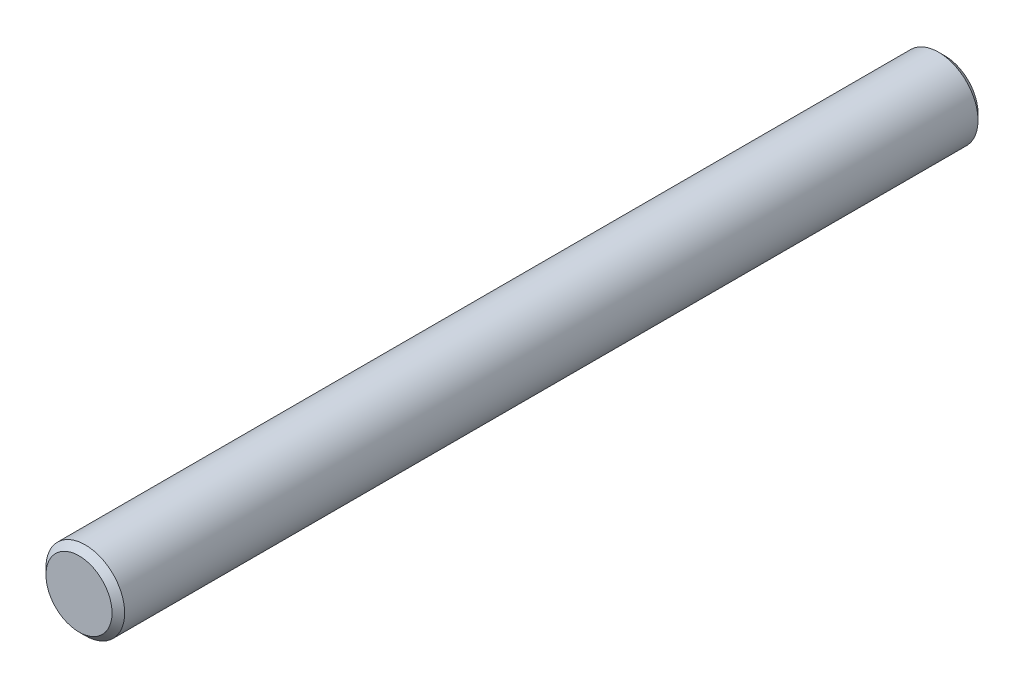
ISO-10303-21;
HEADER;
FILE_DESCRIPTION(('STEP AP214'),'2;1');
FILE_NAME('part.step','',(''),(''),'','','');
FILE_SCHEMA(('AUTOMOTIVE_DESIGN { 1 0 10303 214 1 1 1 1 }'));
ENDSEC;
DATA;
#1=APPLICATION_CONTEXT('core data for automotive mechanical design processes');
#2=APPLICATION_PROTOCOL_DEFINITION('international standard','automotive_design',2000,#1);
#3=PRODUCT_CONTEXT('',#1,'mechanical');
#4=PRODUCT('Part','Part','',(#3));
#5=PRODUCT_RELATED_PRODUCT_CATEGORY('part','',(#4));
#6=PRODUCT_DEFINITION_FORMATION('','',#4);
#7=PRODUCT_DEFINITION_CONTEXT('part definition',#1,'design');
#8=PRODUCT_DEFINITION('design','',#6,#7);
#9=PRODUCT_DEFINITION_SHAPE('','',#8);
#10=(LENGTH_UNIT() NAMED_UNIT(*) SI_UNIT(.MILLI.,.METRE.));
#11=(NAMED_UNIT(*) PLANE_ANGLE_UNIT() SI_UNIT($,.RADIAN.));
#12=(NAMED_UNIT(*) SI_UNIT($,.STERADIAN.) SOLID_ANGLE_UNIT());
#13=UNCERTAINTY_MEASURE_WITH_UNIT(LENGTH_MEASURE(1.E-05),#10,'distance_accuracy_value','');
#14=(GEOMETRIC_REPRESENTATION_CONTEXT(3) GLOBAL_UNCERTAINTY_ASSIGNED_CONTEXT((#13)) GLOBAL_UNIT_ASSIGNED_CONTEXT((#10,
#11,#12)) REPRESENTATION_CONTEXT('',''));
#15=CARTESIAN_POINT('',(0.,0.,0.));
#16=DIRECTION('',(0.,0.,1.));
#17=DIRECTION('',(1.,0.,0.));
#18=AXIS2_PLACEMENT_3D('',#15,#16,#17);
#19=CARTESIAN_POINT('',(0.,0.,69.85));
#20=DIRECTION('',(0.,0.,-1.));
#21=DIRECTION('',(-1.,0.,0.));
#22=AXIS2_PLACEMENT_3D('',#19,#20,#21);
#23=CYLINDRICAL_SURFACE('',#22,3.175);
#24=CARTESIAN_POINT('',(0.,0.,0.508000000000008));
#25=DIRECTION('',(0.,0.,1.));
#26=DIRECTION('',(1.,0.,0.));
#27=AXIS2_PLACEMENT_3D('',#24,#25,#26);
#28=CIRCLE('',#27,3.175);
#29=CARTESIAN_POINT('',(3.175,0.,0.508000000000008));
#30=VERTEX_POINT('',#29);
#31=EDGE_CURVE('E50',#30,#30,#28,.T.);
#32=ORIENTED_EDGE('',*,*,#31,.T.);
#33=EDGE_LOOP('',(#32));
#34=FACE_BOUND('',#33,.T.);
#35=CARTESIAN_POINT('',(0.,0.,69.342));
#36=DIRECTION('',(0.,0.,1.));
#37=DIRECTION('',(1.,0.,0.));
#38=AXIS2_PLACEMENT_3D('',#35,#36,#37);
#39=CIRCLE('',#38,3.175);
#40=CARTESIAN_POINT('',(3.175,0.,69.342));
#41=VERTEX_POINT('',#40);
#42=EDGE_CURVE('E54',#41,#41,#39,.F.);
#43=ORIENTED_EDGE('',*,*,#42,.T.);
#44=EDGE_LOOP('',(#43));
#45=FACE_BOUND('',#44,.T.);
#46=ADVANCED_FACE('F38',(#34,#45),#23,.T.);
#47=CARTESIAN_POINT('',(0.,0.,69.85));
#48=DIRECTION('',(0.,0.,1.));
#49=DIRECTION('',(1.,0.,0.));
#50=AXIS2_PLACEMENT_3D('',#47,#48,#49);
#51=PLANE('',#50);
#52=CARTESIAN_POINT('',(0.,0.,69.85));
#53=DIRECTION('',(0.,0.,1.));
#54=DIRECTION('',(1.,0.,0.));
#55=AXIS2_PLACEMENT_3D('',#52,#53,#54);
#56=CIRCLE('',#55,2.667);
#57=CARTESIAN_POINT('',(2.667,0.,69.85));
#58=VERTEX_POINT('',#57);
#59=EDGE_CURVE('E10',#58,#58,#56,.T.);
#60=ORIENTED_EDGE('',*,*,#59,.T.);
#61=EDGE_LOOP('',(#60));
#62=FACE_BOUND('',#61,.T.);
#63=ADVANCED_FACE('F70',(#62),#51,.T.);
#64=CARTESIAN_POINT('',(0.,0.,0.));
#65=DIRECTION('',(0.,0.,1.));
#66=DIRECTION('',(1.,0.,0.));
#67=AXIS2_PLACEMENT_3D('',#64,#65,#66);
#68=PLANE('',#67);
#69=CARTESIAN_POINT('',(0.,0.,0.));
#70=DIRECTION('',(0.,0.,1.));
#71=DIRECTION('',(1.,0.,0.));
#72=AXIS2_PLACEMENT_3D('',#69,#70,#71);
#73=CIRCLE('',#72,2.667);
#74=CARTESIAN_POINT('',(2.667,0.,0.));
#75=VERTEX_POINT('',#74);
#76=EDGE_CURVE('E46',#75,#75,#73,.F.);
#77=ORIENTED_EDGE('',*,*,#76,.T.);
#78=EDGE_LOOP('',(#77));
#79=FACE_BOUND('',#78,.T.);
#80=ADVANCED_FACE('F67',(#79),#68,.F.);
#81=CARTESIAN_POINT('',(0.,0.,0.508000000000008));
#82=DIRECTION('',(0.,0.,1.));
#83=DIRECTION('',(1.,0.,0.));
#84=AXIS2_PLACEMENT_3D('',#81,#82,#83);
#85=CONICAL_SURFACE('',#84,3.175,0.785398163397444);
#86=ORIENTED_EDGE('',*,*,#76,.F.);
#87=EDGE_LOOP('',(#86));
#88=FACE_BOUND('',#87,.T.);
#89=ORIENTED_EDGE('',*,*,#31,.F.);
#90=EDGE_LOOP('',(#89));
#91=FACE_BOUND('',#90,.T.);
#92=ADVANCED_FACE('F63',(#88,#91),#85,.T.);
#93=CARTESIAN_POINT('',(0.,0.,69.85));
#94=DIRECTION('',(0.,0.,-1.));
#95=DIRECTION('',(-1.,0.,0.));
#96=AXIS2_PLACEMENT_3D('',#93,#94,#95);
#97=CONICAL_SURFACE('',#96,2.667,0.785398163397437);
#98=ORIENTED_EDGE('',*,*,#42,.F.);
#99=EDGE_LOOP('',(#98));
#100=FACE_BOUND('',#99,.T.);
#101=ORIENTED_EDGE('',*,*,#59,.F.);
#102=EDGE_LOOP('',(#101));
#103=FACE_BOUND('',#102,.T.);
#104=ADVANCED_FACE('F41',(#100,#103),#97,.T.);
#105=CLOSED_SHELL('',(#46,#63,#80,#92,#104));
#106=MANIFOLD_SOLID_BREP('B2',#105);
#107=ADVANCED_BREP_SHAPE_REPRESENTATION('',(#18,#106),#14);
#108=SHAPE_DEFINITION_REPRESENTATION(#9,#107);
ENDSEC;
END-ISO-10303-21;
